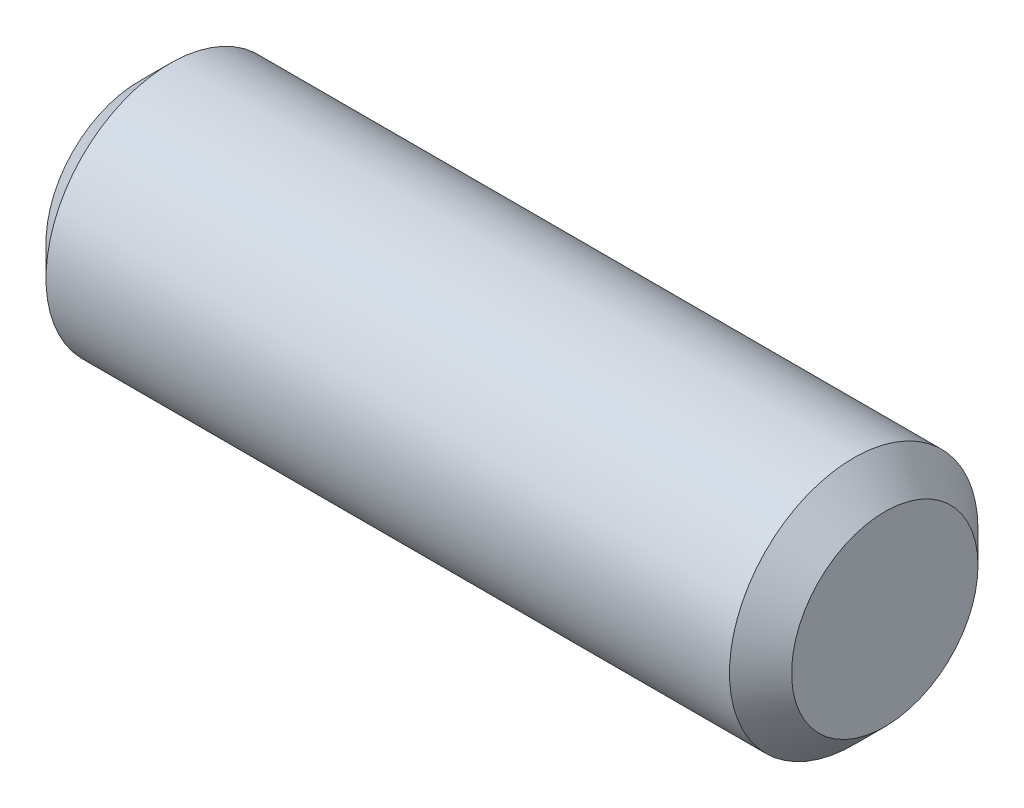
ISO-10303-21;
HEADER;
FILE_DESCRIPTION(('STEP AP214'),'2;1');
FILE_NAME('part.step','',(''),(''),'','','');
FILE_SCHEMA(('AUTOMOTIVE_DESIGN { 1 0 10303 214 1 1 1 1 }'));
ENDSEC;
DATA;
#1=APPLICATION_CONTEXT('core data for automotive mechanical design processes');
#2=APPLICATION_PROTOCOL_DEFINITION('international standard','automotive_design',2000,#1);
#3=PRODUCT_CONTEXT('',#1,'mechanical');
#4=PRODUCT('Part','Part','',(#3));
#5=PRODUCT_RELATED_PRODUCT_CATEGORY('part','',(#4));
#6=PRODUCT_DEFINITION_FORMATION('','',#4);
#7=PRODUCT_DEFINITION_CONTEXT('part definition',#1,'design');
#8=PRODUCT_DEFINITION('design','',#6,#7);
#9=PRODUCT_DEFINITION_SHAPE('','',#8);
#10=(LENGTH_UNIT() NAMED_UNIT(*) SI_UNIT(.MILLI.,.METRE.));
#11=(NAMED_UNIT(*) PLANE_ANGLE_UNIT() SI_UNIT($,.RADIAN.));
#12=(NAMED_UNIT(*) SI_UNIT($,.STERADIAN.) SOLID_ANGLE_UNIT());
#13=UNCERTAINTY_MEASURE_WITH_UNIT(LENGTH_MEASURE(1.E-05),#10,'distance_accuracy_value','');
#14=(GEOMETRIC_REPRESENTATION_CONTEXT(3) GLOBAL_UNCERTAINTY_ASSIGNED_CONTEXT((#13)) GLOBAL_UNIT_ASSIGNED_CONTEXT((#10,
#11,#12)) REPRESENTATION_CONTEXT('',''));
#15=CARTESIAN_POINT('',(0.,0.,0.));
#16=DIRECTION('',(0.,0.,1.));
#17=DIRECTION('',(1.,0.,0.));
#18=AXIS2_PLACEMENT_3D('',#15,#16,#17);
#19=CARTESIAN_POINT('',(-12.,0.,0.));
#20=DIRECTION('',(1.,0.,0.));
#21=DIRECTION('',(0.,0.,-1.));
#22=AXIS2_PLACEMENT_3D('',#19,#20,#21);
#23=CYLINDRICAL_SURFACE('',#22,4.);
#24=CARTESIAN_POINT('',(11.,0.,0.));
#25=DIRECTION('',(1.,0.,0.));
#26=DIRECTION('',(0.,0.,-1.));
#27=AXIS2_PLACEMENT_3D('',#24,#25,#26);
#28=CIRCLE('',#27,4.);
#29=CARTESIAN_POINT('',(11.,0.,-4.));
#30=VERTEX_POINT('',#29);
#31=EDGE_CURVE('E38',#30,#30,#28,.F.);
#32=CARTESIAN_POINT('',(-11.,0.,0.));
#33=DIRECTION('',(1.,0.,0.));
#34=DIRECTION('',(0.,0.,-1.));
#35=AXIS2_PLACEMENT_3D('',#32,#33,#34);
#36=CIRCLE('',#35,4.);
#37=CARTESIAN_POINT('',(-11.,0.,-4.));
#38=VERTEX_POINT('',#37);
#39=EDGE_CURVE('E42',#38,#38,#36,.T.);
#40=CARTESIAN_POINT('',(11.,0.,-4.));
#41=CARTESIAN_POINT('',(10.7708333333333,0.,-4.));
#42=CARTESIAN_POINT('',(10.5416666666667,0.,-4.));
#43=CARTESIAN_POINT('',(10.0833333333333,0.,-4.));
#44=CARTESIAN_POINT('',(9.85416666666667,0.,-4.));
#45=CARTESIAN_POINT('',(9.39583333333334,0.,-4.));
#46=CARTESIAN_POINT('',(9.16666666666667,0.,-4.));
#47=CARTESIAN_POINT('',(8.70833333333334,0.,-4.));
#48=CARTESIAN_POINT('',(8.47916666666667,0.,-4.));
#49=CARTESIAN_POINT('',(8.02083333333333,0.,-4.));
#50=CARTESIAN_POINT('',(7.79166666666667,0.,-4.));
#51=CARTESIAN_POINT('',(7.33333333333334,0.,-4.));
#52=CARTESIAN_POINT('',(7.10416666666667,0.,-4.));
#53=CARTESIAN_POINT('',(6.64583333333334,0.,-4.));
#54=CARTESIAN_POINT('',(6.41666666666667,0.,-4.));
#55=CARTESIAN_POINT('',(5.95833333333334,0.,-4.));
#56=CARTESIAN_POINT('',(5.72916666666667,0.,-4.));
#57=CARTESIAN_POINT('',(5.27083333333334,0.,-4.));
#58=CARTESIAN_POINT('',(5.04166666666667,0.,-4.));
#59=CARTESIAN_POINT('',(4.58333333333334,0.,-4.));
#60=CARTESIAN_POINT('',(4.35416666666667,0.,-4.));
#61=CARTESIAN_POINT('',(3.89583333333334,0.,-4.));
#62=CARTESIAN_POINT('',(3.66666666666667,0.,-4.));
#63=CARTESIAN_POINT('',(3.20833333333334,0.,-4.));
#64=CARTESIAN_POINT('',(2.97916666666667,0.,-4.));
#65=CARTESIAN_POINT('',(2.52083333333334,0.,-4.));
#66=CARTESIAN_POINT('',(2.29166666666667,0.,-4.));
#67=CARTESIAN_POINT('',(1.83333333333334,0.,-4.));
#68=CARTESIAN_POINT('',(1.60416666666667,0.,-4.));
#69=CARTESIAN_POINT('',(1.14583333333334,0.,-4.));
#70=CARTESIAN_POINT('',(0.916666666666674,0.,-4.));
#71=CARTESIAN_POINT('',(0.458333333333341,0.,-4.));
#72=CARTESIAN_POINT('',(0.229166666666675,0.,-4.));
#73=CARTESIAN_POINT('',(-0.229166666666658,0.,-4.));
#74=CARTESIAN_POINT('',(-0.458333333333324,0.,-4.));
#75=CARTESIAN_POINT('',(-0.916666666666657,0.,-4.));
#76=CARTESIAN_POINT('',(-1.14583333333332,0.,-4.));
#77=CARTESIAN_POINT('',(-1.60416666666666,0.,-4.));
#78=CARTESIAN_POINT('',(-1.83333333333332,0.,-4.));
#79=CARTESIAN_POINT('',(-2.29166666666666,0.,-4.));
#80=CARTESIAN_POINT('',(-2.52083333333332,0.,-4.));
#81=CARTESIAN_POINT('',(-2.97916666666666,0.,-4.));
#82=CARTESIAN_POINT('',(-3.20833333333332,0.,-4.));
#83=CARTESIAN_POINT('',(-3.66666666666666,0.,-4.));
#84=CARTESIAN_POINT('',(-3.89583333333332,0.,-4.));
#85=CARTESIAN_POINT('',(-4.35416666666666,0.,-4.));
#86=CARTESIAN_POINT('',(-4.58333333333332,0.,-4.));
#87=CARTESIAN_POINT('',(-5.04166666666666,0.,-4.));
#88=CARTESIAN_POINT('',(-5.27083333333332,0.,-4.));
#89=CARTESIAN_POINT('',(-5.72916666666665,0.,-4.));
#90=CARTESIAN_POINT('',(-5.95833333333332,0.,-4.));
#91=CARTESIAN_POINT('',(-6.41666666666665,0.,-4.));
#92=CARTESIAN_POINT('',(-6.64583333333332,0.,-4.));
#93=CARTESIAN_POINT('',(-7.10416666666665,0.,-4.));
#94=CARTESIAN_POINT('',(-7.33333333333332,0.,-4.));
#95=CARTESIAN_POINT('',(-7.79166666666665,0.,-4.));
#96=CARTESIAN_POINT('',(-8.02083333333332,0.,-4.));
#97=CARTESIAN_POINT('',(-8.47916666666665,0.,-4.));
#98=CARTESIAN_POINT('',(-8.70833333333332,0.,-4.));
#99=CARTESIAN_POINT('',(-9.16666666666665,0.,-4.));
#100=CARTESIAN_POINT('',(-9.39583333333332,0.,-4.));
#101=CARTESIAN_POINT('',(-9.85416666666665,0.,-4.));
#102=CARTESIAN_POINT('',(-10.0833333333333,0.,-4.));
#103=CARTESIAN_POINT('',(-10.5416666666667,0.,-4.));
#104=CARTESIAN_POINT('',(-10.7708333333333,0.,-4.));
#105=CARTESIAN_POINT('',(-11.,0.,-4.));
#106=B_SPLINE_CURVE_WITH_KNOTS('',3,(#40,#41,#42,#43,#44,#45,#46,#47,#48,#49,#50,#51,#52,#53,
#54,#55,#56,#57,#58,#59,#60,#61,#62,#63,#64,#65,#66,#67,#68,#69,#70,#71,#72,#73,#74,#75,#76,#77,
#78,#79,#80,#81,#82,#83,#84,#85,#86,#87,#88,#89,#90,#91,#92,#93,#94,#95,#96,#97,#98,#99,#100,
#101,#102,#103,#104,#105),.UNSPECIFIED.,.F.,.F.,(4,2,2,2,2,2,2,2,2,2,2,2,2,2,2,2,2,2,2,2,2,2,2,
2,2,2,2,2,2,2,2,2,4),(0.,0.687500000000001,1.375,2.0625,2.75,3.4375,4.125,4.8125,5.5,6.1875,
6.875,7.56249999999999,8.24999999999999,8.93749999999999,9.62499999999999,10.3125,11.,11.6875,
12.375,13.0625,13.75,14.4375,15.125,15.8125,16.5,17.1875,17.875,18.5625,19.25,19.9375,20.625,
21.3125,22.),.UNSPECIFIED.);
#107=EDGE_CURVE('BSEAM31',#30,#38,#106,.T.);
#108=ORIENTED_EDGE('',*,*,#31,.T.);
#109=ORIENTED_EDGE('',*,*,#39,.T.);
#110=ORIENTED_EDGE('',*,*,#107,.T.);
#111=ORIENTED_EDGE('',*,*,#107,.F.);
#112=EDGE_LOOP('',(#108,#110,#109,#111));
#113=FACE_BOUND('',#112,.T.);
#114=ADVANCED_FACE('F31',(#113),#23,.T.);
#115=CARTESIAN_POINT('',(-12.,0.,0.));
#116=DIRECTION('',(1.,0.,0.));
#117=DIRECTION('',(0.,0.,-1.));
#118=AXIS2_PLACEMENT_3D('',#115,#116,#117);
#119=PLANE('',#118);
#120=CARTESIAN_POINT('',(-12.,0.,0.));
#121=DIRECTION('',(1.,0.,0.));
#122=DIRECTION('',(0.,0.,-1.));
#123=AXIS2_PLACEMENT_3D('',#120,#121,#122);
#124=CIRCLE('',#123,2.99999999999998);
#125=CARTESIAN_POINT('',(-12.,0.,-2.99999999999998));
#126=VERTEX_POINT('',#125);
#127=EDGE_CURVE('E10',#126,#126,#124,.F.);
#128=ORIENTED_EDGE('',*,*,#127,.T.);
#129=EDGE_LOOP('',(#128));
#130=FACE_BOUND('',#129,.T.);
#131=ADVANCED_FACE('F62',(#130),#119,.F.);
#132=CARTESIAN_POINT('',(12.,0.,0.));
#133=DIRECTION('',(1.,0.,0.));
#134=DIRECTION('',(0.,0.,-1.));
#135=AXIS2_PLACEMENT_3D('',#132,#133,#134);
#136=PLANE('',#135);
#137=CARTESIAN_POINT('',(12.,0.,0.));
#138=DIRECTION('',(1.,0.,0.));
#139=DIRECTION('',(0.,0.,-1.));
#140=AXIS2_PLACEMENT_3D('',#137,#138,#139);
#141=CIRCLE('',#140,3.);
#142=CARTESIAN_POINT('',(12.,0.,-3.));
#143=VERTEX_POINT('',#142);
#144=EDGE_CURVE('E46',#143,#143,#141,.T.);
#145=ORIENTED_EDGE('',*,*,#144,.T.);
#146=EDGE_LOOP('',(#145));
#147=FACE_BOUND('',#146,.T.);
#148=ADVANCED_FACE('F52',(#147),#136,.T.);
#149=CARTESIAN_POINT('',(12.,0.,0.));
#150=DIRECTION('',(-1.,0.,0.));
#151=DIRECTION('',(0.,0.,1.));
#152=AXIS2_PLACEMENT_3D('',#149,#150,#151);
#153=CONICAL_SURFACE('',#152,3.,0.785398163397449);
#154=ORIENTED_EDGE('',*,*,#31,.F.);
#155=EDGE_LOOP('',(#154));
#156=FACE_BOUND('',#155,.T.);
#157=ORIENTED_EDGE('',*,*,#144,.F.);
#158=EDGE_LOOP('',(#157));
#159=FACE_BOUND('',#158,.T.);
#160=ADVANCED_FACE('F54',(#156,#159),#153,.T.);
#161=CARTESIAN_POINT('',(-11.,0.,0.));
#162=DIRECTION('',(1.,0.,0.));
#163=DIRECTION('',(0.,0.,-1.));
#164=AXIS2_PLACEMENT_3D('',#161,#162,#163);
#165=CONICAL_SURFACE('',#164,4.,0.785398163397449);
#166=ORIENTED_EDGE('',*,*,#127,.F.);
#167=EDGE_LOOP('',(#166));
#168=FACE_BOUND('',#167,.T.);
#169=ORIENTED_EDGE('',*,*,#39,.F.);
#170=EDGE_LOOP('',(#169));
#171=FACE_BOUND('',#170,.T.);
#172=ADVANCED_FACE('F33',(#168,#171),#165,.T.);
#173=CLOSED_SHELL('',(#114,#131,#148,#160,#172));
#174=MANIFOLD_SOLID_BREP('B2',#173);
#175=ADVANCED_BREP_SHAPE_REPRESENTATION('',(#18,#174),#14);
#176=SHAPE_DEFINITION_REPRESENTATION(#9,#175);
ENDSEC;
END-ISO-10303-21;
